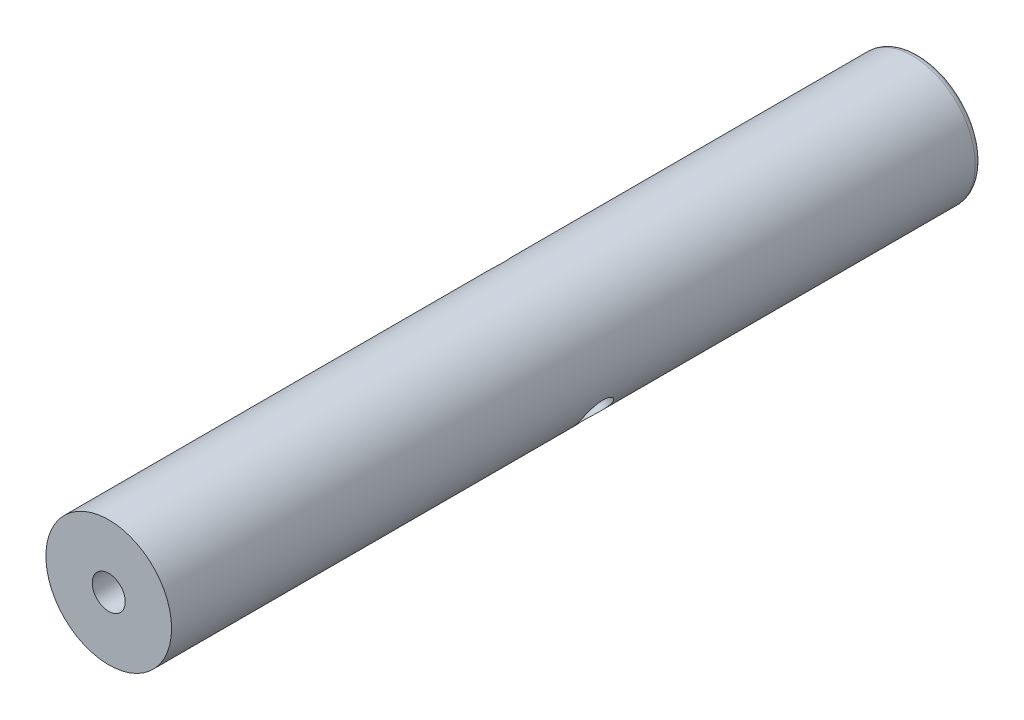
ISO-10303-21;
HEADER;
FILE_DESCRIPTION(('STEP AP214'),'2;1');
FILE_NAME('part.step','',(''),(''),'','','');
FILE_SCHEMA(('AUTOMOTIVE_DESIGN { 1 0 10303 214 1 1 1 1 }'));
ENDSEC;
DATA;
#1=APPLICATION_CONTEXT('core data for automotive mechanical design processes');
#2=APPLICATION_PROTOCOL_DEFINITION('international standard','automotive_design',2000,#1);
#3=PRODUCT_CONTEXT('',#1,'mechanical');
#4=PRODUCT('Part','Part','',(#3));
#5=PRODUCT_RELATED_PRODUCT_CATEGORY('part','',(#4));
#6=PRODUCT_DEFINITION_FORMATION('','',#4);
#7=PRODUCT_DEFINITION_CONTEXT('part definition',#1,'design');
#8=PRODUCT_DEFINITION('design','',#6,#7);
#9=PRODUCT_DEFINITION_SHAPE('','',#8);
#10=(LENGTH_UNIT() NAMED_UNIT(*) SI_UNIT(.MILLI.,.METRE.));
#11=(NAMED_UNIT(*) PLANE_ANGLE_UNIT() SI_UNIT($,.RADIAN.));
#12=(NAMED_UNIT(*) SI_UNIT($,.STERADIAN.) SOLID_ANGLE_UNIT());
#13=UNCERTAINTY_MEASURE_WITH_UNIT(LENGTH_MEASURE(1.E-05),#10,'distance_accuracy_value','');
#14=(GEOMETRIC_REPRESENTATION_CONTEXT(3) GLOBAL_UNCERTAINTY_ASSIGNED_CONTEXT((#13)) GLOBAL_UNIT_ASSIGNED_CONTEXT((#10,
#11,#12)) REPRESENTATION_CONTEXT('',''));
#15=CARTESIAN_POINT('',(0.,0.,0.));
#16=DIRECTION('',(0.,0.,1.));
#17=DIRECTION('',(1.,0.,0.));
#18=AXIS2_PLACEMENT_3D('',#15,#16,#17);
#19=CARTESIAN_POINT('',(240.70838830179,2.59608285867271,61.3999999999995));
#20=DIRECTION('',(0.,0.,-0.999999999999996));
#21=DIRECTION('',(-1.00000000000001,0.,0.));
#22=AXIS2_PLACEMENT_3D('',#19,#20,#21);
#23=CYLINDRICAL_SURFACE('',#22,4.76250000000001);
#24=CARTESIAN_POINT('',(243.739496509193,-1.0773064870155,28.4318732039602));
#25=CARTESIAN_POINT('',(243.739498519894,-1.07730577524482,28.5007758942927));
#26=CARTESIAN_POINT('',(243.744075456086,-1.07354273798289,28.5696972286483));
#27=CARTESIAN_POINT('',(243.762119238602,-1.05853978642648,28.705552344353));
#28=CARTESIAN_POINT('',(243.775590727344,-1.04729596759403,28.7724850686939));
#29=CARTESIAN_POINT('',(243.810635827868,-1.01750133731841,28.9023780880109));
#30=CARTESIAN_POINT('',(243.832198287884,-0.998960581516191,28.9653437119594));
#31=CARTESIAN_POINT('',(243.882308242327,-0.954797208379126,29.0857622526395));
#32=CARTESIAN_POINT('',(243.910856216812,-0.929174104315618,29.1432147901229));
#33=CARTESIAN_POINT('',(243.974288598,-0.870501019559759,29.2523687474057));
#34=CARTESIAN_POINT('',(244.009298005647,-0.837300772366983,29.3039167848535));
#35=CARTESIAN_POINT('',(244.083660587785,-0.76422315865763,29.3984437669702));
#36=CARTESIAN_POINT('',(244.123014200296,-0.724345118617391,29.4414218463124));
#37=CARTESIAN_POINT('',(244.20507205473,-0.637833110240413,29.5182254150977));
#38=CARTESIAN_POINT('',(244.247818742343,-0.591104094712533,29.5518988829388));
#39=CARTESIAN_POINT('',(244.334381768215,-0.492264048628885,29.6081467010068));
#40=CARTESIAN_POINT('',(244.378197930724,-0.440153897883894,29.6307228621673));
#41=CARTESIAN_POINT('',(244.464251396214,-0.332997816090601,29.6636401186979));
#42=CARTESIAN_POINT('',(244.506502145405,-0.278042885752271,29.6742420150192));
#43=CARTESIAN_POINT('',(244.588981672307,-0.165665820691008,29.6837298339136));
#44=CARTESIAN_POINT('',(244.629210777198,-0.108244088000552,29.6826176584528));
#45=CARTESIAN_POINT('',(244.705516642823,0.00591430996196155,29.6688935708931));
#46=CARTESIAN_POINT('',(244.741670854886,0.0626334219955251,29.6565633630841));
#47=CARTESIAN_POINT('',(244.810133637041,0.175044808568638,29.6212077315072));
#48=CARTESIAN_POINT('',(244.842441991252,0.230737025317004,29.598181707703));
#49=CARTESIAN_POINT('',(244.903020156513,0.339889711854959,29.541869083887));
#50=CARTESIAN_POINT('',(244.931247698698,0.393323254493654,29.5084850069056));
#51=CARTESIAN_POINT('',(244.983079813202,0.495674610777752,29.4324785152734));
#52=CARTESIAN_POINT('',(245.006683507353,0.54459156569499,29.3898543489626));
#53=CARTESIAN_POINT('',(245.04989775762,0.637661072623892,29.2950783779095));
#54=CARTESIAN_POINT('',(245.069368546031,0.681628473758173,29.2426807459363));
#55=CARTESIAN_POINT('',(245.103536442906,0.761425255275887,29.1306250628226));
#56=CARTESIAN_POINT('',(245.118233278784,0.797254170926346,29.0709665973643));
#57=CARTESIAN_POINT('',(245.143111939603,0.859486378540484,28.9455923570433));
#58=CARTESIAN_POINT('',(245.153267028014,0.885833680942785,28.8798433936525));
#59=CARTESIAN_POINT('',(245.169107962008,0.927583393434957,28.7444496506819));
#60=CARTESIAN_POINT('',(245.174794876279,0.942988420586256,28.6748058069411));
#61=CARTESIAN_POINT('',(245.181714420048,0.961806854967027,28.5357630589409));
#62=CARTESIAN_POINT('',(245.183071404982,0.965554966336933,28.4664155886794));
#63=CARTESIAN_POINT('',(245.18170911801,0.961821189174053,28.3280690975248));
#64=CARTESIAN_POINT('',(245.178990264594,0.954340453572999,28.2590700415879));
#65=CARTESIAN_POINT('',(245.169512308462,0.928762491766396,28.1246961545101));
#66=CARTESIAN_POINT('',(245.162828735592,0.910863848697898,28.0592779278115));
#67=CARTESIAN_POINT('',(245.145366727211,0.865413159289326,27.932468005841));
#68=CARTESIAN_POINT('',(245.134587769428,0.837859881757942,27.8710768252977));
#69=CARTESIAN_POINT('',(245.108499123299,0.773541667631291,27.7526151162069));
#70=CARTESIAN_POINT('',(245.093097500093,0.736592390460438,27.6956650167574));
#71=CARTESIAN_POINT('',(245.057683945292,0.655206973135304,27.5890013169025));
#72=CARTESIAN_POINT('',(245.037671174981,0.610769471352034,27.5392890356631));
#73=CARTESIAN_POINT('',(244.992299825162,0.514639661395807,27.4470885172703));
#74=CARTESIAN_POINT('',(244.96680771172,0.462779575371863,27.4048404423805));
#75=CARTESIAN_POINT('',(244.910879252779,0.354615191847352,27.3305238223897));
#76=CARTESIAN_POINT('',(244.880443169991,0.298311130571686,27.2984547366666));
#77=CARTESIAN_POINT('',(244.81518200593,0.183621935296772,27.2456971944411));
#78=CARTESIAN_POINT('',(244.780391903686,0.125255787671423,27.2249244014334));
#79=CARTESIAN_POINT('',(244.706891687592,0.008002738932392,27.1951020324189));
#80=CARTESIAN_POINT('',(244.668182415231,-0.0508840479263269,27.1860499455732));
#81=CARTESIAN_POINT('',(244.589052581292,-0.165539834920595,27.1800791403439));
#82=CARTESIAN_POINT('',(244.548717144732,-0.221349475136187,27.1828075986757));
#83=CARTESIAN_POINT('',(244.466524332763,-0.330086165554025,27.1995040684147));
#84=CARTESIAN_POINT('',(244.424667011392,-0.383013317940409,27.2134716811169));
#85=CARTESIAN_POINT('',(244.341118511407,-0.484333571402954,27.2520530243603));
#86=CARTESIAN_POINT('',(244.299428014522,-0.532753838142911,27.2765971606083));
#87=CARTESIAN_POINT('',(244.217419210603,-0.624460112736745,27.3355725095559));
#88=CARTESIAN_POINT('',(244.177101092105,-0.66774541717421,27.3700050746239));
#89=CARTESIAN_POINT('',(244.098329497188,-0.749513409451317,27.4488236639708));
#90=CARTESIAN_POINT('',(244.05995167781,-0.787842108545239,27.4934450395442));
#91=CARTESIAN_POINT('',(243.987806897313,-0.857806378664281,27.5909255265778));
#92=CARTESIAN_POINT('',(243.954041140034,-0.889440203372806,27.6437867811307));
#93=CARTESIAN_POINT('',(243.891993966997,-0.946214584590143,27.7575896281603));
#94=CARTESIAN_POINT('',(243.863843413065,-0.971203925533231,27.8186782739811));
#95=CARTESIAN_POINT('',(243.815412311448,-1.01346672659896,27.9463681150341));
#96=CARTESIAN_POINT('',(243.795126465446,-1.03074538246595,28.0129655622554));
#97=CARTESIAN_POINT('',(243.766249543385,-1.05510624898559,28.1381053617466));
#98=CARTESIAN_POINT('',(243.756255861049,-1.06342318350885,28.1960901109451));
#99=CARTESIAN_POINT('',(243.742878829541,-1.07452331529563,28.313336466146));
#100=CARTESIAN_POINT('',(243.739494779437,-1.07730709933408,28.372597936082));
#101=CARTESIAN_POINT('',(243.739496509193,-1.0773064870155,28.4318732039602));
#102=B_SPLINE_CURVE_WITH_KNOTS('',3,(#24,#25,#26,#27,#28,#29,#30,#31,#32,#33,#34,#35,#36,#37,
#38,#39,#40,#41,#42,#43,#44,#45,#46,#47,#48,#49,#50,#51,#52,#53,#54,#55,#56,#57,#58,#59,#60,#61,
#62,#63,#64,#65,#66,#67,#68,#69,#70,#71,#72,#73,#74,#75,#76,#77,#78,#79,#80,#81,#82,#83,#84,#85,
#86,#87,#88,#89,#90,#91,#92,#93,#94,#95,#96,#97,#98,#99,#100,#101),.UNSPECIFIED.,.T.,.F.,(4,2,2,
2,2,2,2,2,2,2,2,2,2,2,2,2,2,2,2,2,2,2,2,2,2,2,2,2,2,2,2,2,2,2,2,2,2,2,4),(0.,0.20649018215045,
0.41308822494475,0.619402553891822,0.825731065151464,1.03657512737689,1.24744046820384,
1.46157082227239,1.67566622148605,1.8850028143705,2.09430541864816,2.29849291347872,
2.50269186462944,2.70887395720551,2.91509517032055,3.12745456303142,3.33982607908102,
3.55343184571556,3.76698650709079,3.9743499538071,4.18169211075563,4.38520571315107,
4.58874527773331,4.79663626558296,5.00456509637521,5.21829337157573,5.43201029343173,
5.64410892981014,5.85616212236818,6.06190916051432,6.26764890017793,6.47205504834509,
6.67648916497756,6.88623450605494,7.09603449065957,7.31026457561842,7.5243500856506,
7.70200728598688,7.87964564527481),.UNSPECIFIED.);
#103=CARTESIAN_POINT('',(243.739496509193,-1.0773064870155,28.4318732039602));
#104=VERTEX_POINT('',#103);
#105=EDGE_CURVE('E38',#104,#104,#102,.T.);
#106=ORIENTED_EDGE('',*,*,#105,.T.);
#107=EDGE_LOOP('',(#106));
#108=FACE_BOUND('',#107,.T.);
#109=CARTESIAN_POINT('',(236.234215934203,4.22801051488676,28.4318732039603));
#110=CARTESIAN_POINT('',(236.234215934382,4.22801264785046,28.3629705136278));
#111=CARTESIAN_POINT('',(236.236236414613,4.23358278734402,28.2940491792722));
#112=CARTESIAN_POINT('',(236.244360020071,4.25559809286702,28.1581940635675));
#113=CARTESIAN_POINT('',(236.250465277326,4.27204893797294,28.0912613392266));
#114=CARTESIAN_POINT('',(236.266861107924,4.3150263250855,27.9613683199097));
#115=CARTESIAN_POINT('',(236.277145922205,4.34153899946699,27.8984026959611));
#116=CARTESIAN_POINT('',(236.302061318451,4.40351184909499,27.7779841552811));
#117=CARTESIAN_POINT('',(236.316692199101,4.43897263927895,27.7205316177977));
#118=CARTESIAN_POINT('',(236.350841363675,4.51834538281734,27.6113776605148));
#119=CARTESIAN_POINT('',(236.370459601974,4.56242530753983,27.559829623067));
#120=CARTESIAN_POINT('',(236.414541475334,4.65690768520166,27.4653026409503));
#121=CARTESIAN_POINT('',(236.439005599198,4.70731077576813,27.4223245616082));
#122=CARTESIAN_POINT('',(236.49318486905,4.81352953958216,27.3455209928229));
#123=CARTESIAN_POINT('',(236.522975455938,4.8694169364351,27.3118475249817));
#124=CARTESIAN_POINT('',(236.587273436385,4.98399565116127,27.2555997069138));
#125=CARTESIAN_POINT('',(236.621780059174,5.04268650983035,27.2330235457532));
#126=CARTESIAN_POINT('',(236.694087626966,5.15955926297815,27.2001062892226));
#127=CARTESIAN_POINT('',(236.731798298999,5.21772347354143,27.1895043929013));
#128=CARTESIAN_POINT('',(236.81022006684,5.33296887882236,27.180016574007));
#129=CARTESIAN_POINT('',(236.850930674494,5.39005024784886,27.1811287494678));
#130=CARTESIAN_POINT('',(236.933091381253,5.50006998798284,27.1948528370275));
#131=CARTESIAN_POINT('',(236.974499093397,5.55307551689,27.2071830448364));
#132=CARTESIAN_POINT('',(237.057629497693,5.65511868546686,27.2425386764134));
#133=CARTESIAN_POINT('',(237.099352207387,5.70415610234387,27.2655647002177));
#134=CARTESIAN_POINT('',(237.18204108578,5.79767921432673,27.3218773240336));
#135=CARTESIAN_POINT('',(237.222995971842,5.84211607880274,27.355261401015));
#136=CARTESIAN_POINT('',(237.302191053574,5.92512515816486,27.4312678926476));
#137=CARTESIAN_POINT('',(237.340430732692,5.96369625870544,27.4738920589589));
#138=CARTESIAN_POINT('',(237.413750848667,6.03548459438382,27.5686680300122));
#139=CARTESIAN_POINT('',(237.4487033719,6.06850829925742,27.6210656619849));
#140=CARTESIAN_POINT('',(237.512529247281,6.12734051109151,27.7331213450986));
#141=CARTESIAN_POINT('',(237.541402252263,6.15314860603751,27.7927798105573));
#142=CARTESIAN_POINT('',(237.591768961075,6.19736387570878,27.9181540508784));
#143=CARTESIAN_POINT('',(237.613218803009,6.21572716641497,27.983903014269));
#144=CARTESIAN_POINT('',(237.647291690947,6.2445891135173,28.1192967572396));
#145=CARTESIAN_POINT('',(237.659916847539,6.25508965047902,28.1889406009805));
#146=CARTESIAN_POINT('',(237.675348616753,6.2678909807781,28.3279833489808));
#147=CARTESIAN_POINT('',(237.678429269806,6.2704206692413,28.3973308192423));
#148=CARTESIAN_POINT('',(237.675363898585,6.26789076470276,28.5356773103968));
#149=CARTESIAN_POINT('',(237.669218821571,6.2628319508572,28.6046763663338));
#150=CARTESIAN_POINT('',(237.648268337014,6.24536366589736,28.7390502534115));
#151=CARTESIAN_POINT('',(237.633624936888,6.23309164883563,28.80446848011));
#152=CARTESIAN_POINT('',(237.596603935692,6.20146677927271,28.9312784020805));
#153=CARTESIAN_POINT('',(237.57422534821,6.18211302367058,28.992669582624));
#154=CARTESIAN_POINT('',(237.522295822495,6.13606115634319,29.1111312917146));
#155=CARTESIAN_POINT('',(237.492601776468,6.10921487705923,29.1680813911638));
#156=CARTESIAN_POINT('',(237.427693860297,6.04867837208012,29.2747450910188));
#157=CARTESIAN_POINT('',(237.392478986348,6.014986901453,29.3244573722585));
#158=CARTESIAN_POINT('',(237.316993554331,5.94014407080298,29.4166578906512));
#159=CARTESIAN_POINT('',(237.276609380597,5.89881085314434,29.4589059655405));
#160=CARTESIAN_POINT('',(237.193300942657,5.81000077178608,29.5332225855308));
#161=CARTESIAN_POINT('',(237.150376813496,5.7625242345564,29.565291671254));
#162=CARTESIAN_POINT('',(237.064030975152,5.66273932964525,29.6180492134796));
#163=CARTESIAN_POINT('',(237.020615494821,5.61047027120394,29.6388220064872));
#164=CARTESIAN_POINT('',(236.934601414512,5.50206299657204,29.6686443755017));
#165=CARTESIAN_POINT('',(236.892002641503,5.44592561177877,29.6776964623475));
#166=CARTESIAN_POINT('',(236.81031517781,5.33307775674519,29.6836672675767));
#167=CARTESIAN_POINT('',(236.771159775926,5.27643397609054,29.6809388092449));
#168=CARTESIAN_POINT('',(236.696074161562,5.16267336472571,29.6642423395058));
#169=CARTESIAN_POINT('',(236.660143834724,5.10555655086736,29.6502747268037));
#170=CARTESIAN_POINT('',(236.592502035427,4.99299220216263,29.6116933835602));
#171=CARTESIAN_POINT('',(236.560764726261,4.93753624694919,29.5871492473122));
#172=CARTESIAN_POINT('',(236.501672419633,4.82963080678321,29.5281738983647));
#173=CARTESIAN_POINT('',(236.474318022388,4.77718173423794,29.4937413332967));
#174=CARTESIAN_POINT('',(236.42351460557,4.67564365484717,29.4149227439498));
#175=CARTESIAN_POINT('',(236.400185511525,4.6266773443323,29.3703013683764));
#176=CARTESIAN_POINT('',(236.358298704435,4.53532438139132,29.2728208813428));
#177=CARTESIAN_POINT('',(236.339742236029,4.49293944644223,29.2199596267899));
#178=CARTESIAN_POINT('',(236.306920858453,4.41550599618681,29.1061567797603));
#179=CARTESIAN_POINT('',(236.292754843032,4.38063129397243,29.0450681339394));
#180=CARTESIAN_POINT('',(236.269071029214,4.32087518197724,28.9173782928864));
#181=CARTESIAN_POINT('',(236.259550100381,4.29598704402434,28.8507808456652));
#182=CARTESIAN_POINT('',(236.246218884073,4.26063726160545,28.725641046174));
#183=CARTESIAN_POINT('',(236.241712552437,4.24844144012093,28.6676562969755));
#184=CARTESIAN_POINT('',(236.23571123708,4.23212757756097,28.5504099417745));
#185=CARTESIAN_POINT('',(236.234215934048,4.22800867995123,28.4911484718385));
#186=CARTESIAN_POINT('',(236.234215934203,4.22801051488676,28.4318732039603));
#187=B_SPLINE_CURVE_WITH_KNOTS('',3,(#109,#110,#111,#112,#113,#114,#115,#116,#117,#118,#119,
#120,#121,#122,#123,#124,#125,#126,#127,#128,#129,#130,#131,#132,#133,#134,#135,#136,#137,#138,
#139,#140,#141,#142,#143,#144,#145,#146,#147,#148,#149,#150,#151,#152,#153,#154,#155,#156,#157,
#158,#159,#160,#161,#162,#163,#164,#165,#166,#167,#168,#169,#170,#171,#172,#173,#174,#175,#176,
#177,#178,#179,#180,#181,#182,#183,#184,#185,#186),.UNSPECIFIED.,.T.,.F.,(4,2,2,2,2,2,2,2,2,2,2,
2,2,2,2,2,2,2,2,2,2,2,2,2,2,2,2,2,2,2,2,2,2,2,2,2,2,2,4),(0.,0.206490182150463,
0.413088224944733,0.619402553891792,0.825731065151441,1.03657512737685,1.24744046820379,
1.46157082227237,1.67566622148606,1.88500281437053,2.09430541864821,2.29849291347874,
2.50269186462941,2.70887395720576,2.91509517032116,3.12745456303206,3.33982607908167,
3.55343184571622,3.76698650709153,3.97434995380786,4.18169211075637,4.38520571315178,
4.58874527773402,4.79663626558365,5.00456509637584,5.21829337157597,5.43201029343164,
5.64410892981012,5.85616212236817,6.06190916051432,6.26764890017794,6.47205504834508,
6.67648916497752,6.88623450605484,7.09603449065948,7.31026457561841,7.52435008565063,
7.70200728598688,7.87964564527481),.UNSPECIFIED.);
#188=CARTESIAN_POINT('',(236.234215934203,4.22801051488676,28.4318732039603));
#189=VERTEX_POINT('',#188);
#190=EDGE_CURVE('E11',#189,#189,#187,.T.);
#191=ORIENTED_EDGE('',*,*,#190,.T.);
#192=EDGE_LOOP('',(#191));
#193=FACE_BOUND('',#192,.T.);
#194=CARTESIAN_POINT('',(240.70838830179,2.5960828586727,0.5));
#195=DIRECTION('',(0.,0.,0.999999999999996));
#196=DIRECTION('',(1.00000000000001,0.,0.));
#197=AXIS2_PLACEMENT_3D('',#194,#195,#196);
#198=CIRCLE('',#197,4.76250000000001);
#199=CARTESIAN_POINT('',(245.47088830179,2.5960828586727,0.500000000000001));
#200=VERTEX_POINT('',#199);
#201=EDGE_CURVE('E75',#200,#200,#198,.T.);
#202=ORIENTED_EDGE('',*,*,#201,.T.);
#203=EDGE_LOOP('',(#202));
#204=FACE_BOUND('',#203,.T.);
#205=CARTESIAN_POINT('',(240.70838830179,2.59608285867271,61.3999999999995));
#206=DIRECTION('',(0.,0.,0.999999999999996));
#207=DIRECTION('',(1.00000000000001,0.,0.));
#208=AXIS2_PLACEMENT_3D('',#205,#206,#207);
#209=CIRCLE('',#208,4.76250000000001);
#210=CARTESIAN_POINT('',(245.47088830179,2.59608285867271,61.3999999999995));
#211=VERTEX_POINT('',#210);
#212=EDGE_CURVE('E72',#211,#211,#209,.T.);
#213=ORIENTED_EDGE('',*,*,#212,.F.);
#214=EDGE_LOOP('',(#213));
#215=FACE_BOUND('',#214,.T.);
#216=ADVANCED_FACE('F34',(#108,#193,#204,#215),#23,.T.);
#217=CARTESIAN_POINT('',(240.70838830179,2.59608285867271,61.3999999999995));
#218=DIRECTION('',(0.,0.,0.999999999999996));
#219=DIRECTION('',(1.00000000000001,0.,0.));
#220=AXIS2_PLACEMENT_3D('',#217,#218,#219);
#221=PLANE('',#220);
#222=CARTESIAN_POINT('',(240.70838830179,2.59608285867271,61.3999999999995));
#223=DIRECTION('',(0.,0.,0.999999999999996));
#224=DIRECTION('',(1.00000000000001,0.,0.));
#225=AXIS2_PLACEMENT_3D('',#222,#223,#224);
#226=CIRCLE('',#225,1.25);
#227=CARTESIAN_POINT('',(241.95838830179,2.59608285867271,61.3999999999995));
#228=VERTEX_POINT('',#227);
#229=EDGE_CURVE('E62',#228,#228,#226,.T.);
#230=ORIENTED_EDGE('',*,*,#229,.F.);
#231=EDGE_LOOP('',(#230));
#232=FACE_BOUND('',#231,.T.);
#233=ORIENTED_EDGE('',*,*,#212,.T.);
#234=EDGE_LOOP('',(#233));
#235=FACE_BOUND('',#234,.T.);
#236=ADVANCED_FACE('F99',(#232,#235),#221,.T.);
#237=CARTESIAN_POINT('',(240.70838830179,2.5960828586727,0.));
#238=DIRECTION('',(0.,0.,0.999999999999996));
#239=DIRECTION('',(1.00000000000001,0.,0.));
#240=AXIS2_PLACEMENT_3D('',#237,#238,#239);
#241=PLANE('',#240);
#242=CARTESIAN_POINT('',(240.70838830179,2.5960828586727,0.));
#243=DIRECTION('',(0.,0.,0.999999999999996));
#244=DIRECTION('',(1.00000000000001,0.,0.));
#245=AXIS2_PLACEMENT_3D('',#242,#243,#244);
#246=CIRCLE('',#245,4.26250000000001);
#247=CARTESIAN_POINT('',(244.97088830179,2.59608285867269,0.));
#248=VERTEX_POINT('',#247);
#249=EDGE_CURVE('E46',#248,#248,#246,.F.);
#250=ORIENTED_EDGE('',*,*,#249,.T.);
#251=EDGE_LOOP('',(#250));
#252=FACE_BOUND('',#251,.T.);
#253=CARTESIAN_POINT('',(240.708388301788,2.59608285867239,0.));
#254=DIRECTION('',(0.,0.,-0.999999999999996));
#255=DIRECTION('',(-1.00000000000001,0.,0.));
#256=AXIS2_PLACEMENT_3D('',#253,#254,#255);
#257=CIRCLE('',#256,2.09999999999999);
#258=CARTESIAN_POINT('',(238.608388301788,2.59608285867239,0.));
#259=VERTEX_POINT('',#258);
#260=EDGE_CURVE('E61',#259,#259,#257,.T.);
#261=ORIENTED_EDGE('',*,*,#260,.F.);
#262=EDGE_LOOP('',(#261));
#263=FACE_BOUND('',#262,.T.);
#264=ADVANCED_FACE('F98',(#252,#263),#241,.F.);
#265=CARTESIAN_POINT('',(240.708388301788,2.59608285867232,14.));
#266=DIRECTION('',(0.,0.,-0.999999999999996));
#267=DIRECTION('',(-1.00000000000001,0.,0.));
#268=AXIS2_PLACEMENT_3D('',#265,#266,#267);
#269=CONICAL_SURFACE('',#268,2.09999999999999,1.02974425867665);
#270=CARTESIAN_POINT('',(240.708388301788,2.59608285867244,15.2618072999579));
#271=VERTEX_POINT('',#270);
#272=VERTEX_LOOP('',#271);
#273=FACE_BOUND('',#272,.T.);
#274=CARTESIAN_POINT('',(240.708388301788,2.59608285867232,14.));
#275=DIRECTION('',(0.,0.,-0.999999999999996));
#276=DIRECTION('',(-1.00000000000001,0.,0.));
#277=AXIS2_PLACEMENT_3D('',#274,#275,#276);
#278=CIRCLE('',#277,2.09999999999999);
#279=CARTESIAN_POINT('',(238.608388301788,2.59608285867239,14.));
#280=VERTEX_POINT('',#279);
#281=EDGE_CURVE('E65',#280,#280,#278,.T.);
#282=ORIENTED_EDGE('',*,*,#281,.T.);
#283=EDGE_LOOP('',(#282));
#284=FACE_BOUND('',#283,.T.);
#285=ADVANCED_FACE('F94',(#273,#284),#269,.F.);
#286=CARTESIAN_POINT('',(240.708388301788,2.59608285867239,0.));
#287=DIRECTION('',(0.,0.,-0.999999999999996));
#288=DIRECTION('',(-1.00000000000001,0.,0.));
#289=AXIS2_PLACEMENT_3D('',#286,#287,#288);
#290=CYLINDRICAL_SURFACE('',#289,2.09999999999999);
#291=CARTESIAN_POINT('',(238.608388301788,2.59608285867239,14.));
#292=CARTESIAN_POINT('',(238.608388301788,2.59608285867239,13.8541666666666));
#293=CARTESIAN_POINT('',(238.608388301788,2.59608285867239,13.7083333333333));
#294=CARTESIAN_POINT('',(238.608388301788,2.59608285867239,13.4166666666666));
#295=CARTESIAN_POINT('',(238.608388301788,2.59608285867239,13.2708333333333));
#296=CARTESIAN_POINT('',(238.608388301788,2.59608285867239,12.9791666666666));
#297=CARTESIAN_POINT('',(238.608388301788,2.59608285867239,12.8333333333333));
#298=CARTESIAN_POINT('',(238.608388301788,2.59608285867239,12.5416666666666));
#299=CARTESIAN_POINT('',(238.608388301788,2.59608285867239,12.3958333333333));
#300=CARTESIAN_POINT('',(238.608388301788,2.59608285867239,12.1041666666666));
#301=CARTESIAN_POINT('',(238.608388301788,2.59608285867239,11.9583333333333));
#302=CARTESIAN_POINT('',(238.608388301788,2.59608285867239,11.6666666666666));
#303=CARTESIAN_POINT('',(238.608388301788,2.59608285867239,11.5208333333333));
#304=CARTESIAN_POINT('',(238.608388301788,2.59608285867239,11.2291666666666));
#305=CARTESIAN_POINT('',(238.608388301788,2.59608285867239,11.0833333333333));
#306=CARTESIAN_POINT('',(238.608388301788,2.59608285867239,10.7916666666666));
#307=CARTESIAN_POINT('',(238.608388301788,2.59608285867239,10.6458333333333));
#308=CARTESIAN_POINT('',(238.608388301788,2.59608285867239,10.3541666666666));
#309=CARTESIAN_POINT('',(238.608388301788,2.59608285867239,10.2083333333333));
#310=CARTESIAN_POINT('',(238.608388301788,2.59608285867239,9.91666666666664));
#311=CARTESIAN_POINT('',(238.608388301788,2.59608285867239,9.7708333333333));
#312=CARTESIAN_POINT('',(238.608388301788,2.59608285867239,9.47916666666664));
#313=CARTESIAN_POINT('',(238.608388301788,2.59608285867239,9.3333333333333));
#314=CARTESIAN_POINT('',(238.608388301788,2.59608285867239,9.04166666666664));
#315=CARTESIAN_POINT('',(238.608388301788,2.59608285867239,8.89583333333331));
#316=CARTESIAN_POINT('',(238.608388301788,2.59608285867239,8.60416666666664));
#317=CARTESIAN_POINT('',(238.608388301788,2.59608285867239,8.45833333333331));
#318=CARTESIAN_POINT('',(238.608388301788,2.59608285867239,8.16666666666664));
#319=CARTESIAN_POINT('',(238.608388301788,2.59608285867239,8.02083333333331));
#320=CARTESIAN_POINT('',(238.608388301788,2.59608285867239,7.72916666666664));
#321=CARTESIAN_POINT('',(238.608388301788,2.59608285867239,7.58333333333331));
#322=CARTESIAN_POINT('',(238.608388301788,2.59608285867239,7.29166666666664));
#323=CARTESIAN_POINT('',(238.608388301788,2.59608285867239,7.14583333333331));
#324=CARTESIAN_POINT('',(238.608388301788,2.59608285867239,6.85416666666665));
#325=CARTESIAN_POINT('',(238.608388301788,2.59608285867239,6.70833333333331));
#326=CARTESIAN_POINT('',(238.608388301788,2.59608285867239,6.41666666666665));
#327=CARTESIAN_POINT('',(238.608388301788,2.59608285867239,6.27083333333332));
#328=CARTESIAN_POINT('',(238.608388301788,2.59608285867239,5.97916666666665));
#329=CARTESIAN_POINT('',(238.608388301788,2.59608285867239,5.83333333333332));
#330=CARTESIAN_POINT('',(238.608388301788,2.59608285867239,5.54166666666665));
#331=CARTESIAN_POINT('',(238.608388301788,2.59608285867239,5.39583333333332));
#332=CARTESIAN_POINT('',(238.608388301788,2.59608285867239,5.10416666666665));
#333=CARTESIAN_POINT('',(238.608388301788,2.59608285867239,4.95833333333332));
#334=CARTESIAN_POINT('',(238.608388301788,2.59608285867239,4.66666666666665));
#335=CARTESIAN_POINT('',(238.608388301788,2.59608285867239,4.52083333333332));
#336=CARTESIAN_POINT('',(238.608388301788,2.59608285867239,4.22916666666665));
#337=CARTESIAN_POINT('',(238.608388301788,2.59608285867239,4.08333333333332));
#338=CARTESIAN_POINT('',(238.608388301788,2.59608285867239,3.79166666666665));
#339=CARTESIAN_POINT('',(238.608388301788,2.59608285867239,3.64583333333332));
#340=CARTESIAN_POINT('',(238.608388301788,2.59608285867239,3.35416666666666));
#341=CARTESIAN_POINT('',(238.608388301788,2.59608285867239,3.20833333333332));
#342=CARTESIAN_POINT('',(238.608388301788,2.59608285867239,2.91666666666666));
#343=CARTESIAN_POINT('',(238.608388301788,2.59608285867239,2.77083333333333));
#344=CARTESIAN_POINT('',(238.608388301788,2.59608285867239,2.47916666666666));
#345=CARTESIAN_POINT('',(238.608388301788,2.59608285867239,2.33333333333333));
#346=CARTESIAN_POINT('',(238.608388301788,2.59608285867239,2.04166666666666));
#347=CARTESIAN_POINT('',(238.608388301788,2.59608285867239,1.89583333333333));
#348=CARTESIAN_POINT('',(238.608388301788,2.59608285867239,1.60416666666666));
#349=CARTESIAN_POINT('',(238.608388301788,2.59608285867239,1.45833333333333));
#350=CARTESIAN_POINT('',(238.608388301788,2.59608285867239,1.16666666666666));
#351=CARTESIAN_POINT('',(238.608388301788,2.59608285867239,1.02083333333333));
#352=CARTESIAN_POINT('',(238.608388301788,2.59608285867239,0.729166666666664));
#353=CARTESIAN_POINT('',(238.608388301788,2.59608285867239,0.583333333333331));
#354=CARTESIAN_POINT('',(238.608388301788,2.59608285867239,0.291666666666666));
#355=CARTESIAN_POINT('',(238.608388301788,2.59608285867239,0.145833333333333));
#356=CARTESIAN_POINT('',(238.608388301788,2.59608285867239,0.));
#357=B_SPLINE_CURVE_WITH_KNOTS('',3,(#291,#292,#293,#294,#295,#296,#297,#298,#299,#300,#301,
#302,#303,#304,#305,#306,#307,#308,#309,#310,#311,#312,#313,#314,#315,#316,#317,#318,#319,#320,
#321,#322,#323,#324,#325,#326,#327,#328,#329,#330,#331,#332,#333,#334,#335,#336,#337,#338,#339,
#340,#341,#342,#343,#344,#345,#346,#347,#348,#349,#350,#351,#352,#353,#354,#355,#356),
.UNSPECIFIED.,.F.,.F.,(4,2,2,2,2,2,2,2,2,2,2,2,2,2,2,2,2,2,2,2,2,2,2,2,2,2,2,2,2,2,2,2,4),(0.,
0.437499999999999,0.874999999999997,1.31249999999999,1.74999999999999,2.18749999999999,
2.62499999999999,3.06249999999999,3.49999999999999,3.93749999999999,4.37499999999999,
4.81249999999999,5.24999999999998,5.68749999999998,6.12499999999998,6.56249999999998,
6.99999999999998,7.43749999999998,7.87499999999998,8.31249999999998,8.74999999999997,
9.18749999999997,9.62499999999997,10.0625,10.5,10.9375,11.375,11.8125,12.25,12.6875,13.125,
13.5625,14.),.UNSPECIFIED.);
#358=EDGE_CURVE('BSEAM91',#280,#259,#357,.T.);
#359=ORIENTED_EDGE('',*,*,#281,.F.);
#360=ORIENTED_EDGE('',*,*,#260,.T.);
#361=ORIENTED_EDGE('',*,*,#358,.T.);
#362=ORIENTED_EDGE('',*,*,#358,.F.);
#363=EDGE_LOOP('',(#359,#361,#360,#362));
#364=FACE_BOUND('',#363,.T.);
#365=ADVANCED_FACE('F91',(#364),#290,.F.);
#366=CARTESIAN_POINT('',(240.70838830179,2.5960828586727,0.5));
#367=DIRECTION('',(0.,0.,0.999999999999996));
#368=DIRECTION('',(1.00000000000001,0.,0.));
#369=AXIS2_PLACEMENT_3D('',#366,#367,#368);
#370=TOROIDAL_SURFACE('',#369,4.26250000000001,0.5);
#371=ORIENTED_EDGE('',*,*,#249,.F.);
#372=EDGE_LOOP('',(#371));
#373=FACE_BOUND('',#372,.T.);
#374=ORIENTED_EDGE('',*,*,#201,.F.);
#375=EDGE_LOOP('',(#374));
#376=FACE_BOUND('',#375,.T.);
#377=ADVANCED_FACE('F36',(#373,#376),#370,.T.);
#378=CARTESIAN_POINT('',(240.70838830179,2.59608285867273,56.3999999999999));
#379=DIRECTION('',(0.,0.,0.999999999999996));
#380=DIRECTION('',(1.00000000000001,0.,0.));
#381=AXIS2_PLACEMENT_3D('',#378,#379,#380);
#382=CONICAL_SURFACE('',#381,1.25,1.02974425867666);
#383=CARTESIAN_POINT('',(240.70838830179,2.59608285867264,55.6489242262155));
#384=VERTEX_POINT('',#383);
#385=VERTEX_LOOP('',#384);
#386=FACE_BOUND('',#385,.T.);
#387=CARTESIAN_POINT('',(240.70838830179,2.59608285867273,56.3999999999999));
#388=DIRECTION('',(0.,0.,0.999999999999996));
#389=DIRECTION('',(1.00000000000001,0.,0.));
#390=AXIS2_PLACEMENT_3D('',#387,#388,#389);
#391=CIRCLE('',#390,1.25);
#392=CARTESIAN_POINT('',(241.95838830179,2.59608285867271,56.3999999999999));
#393=VERTEX_POINT('',#392);
#394=EDGE_CURVE('E59',#393,#393,#391,.T.);
#395=ORIENTED_EDGE('',*,*,#394,.T.);
#396=EDGE_LOOP('',(#395));
#397=FACE_BOUND('',#396,.T.);
#398=ADVANCED_FACE('F52',(#386,#397),#382,.F.);
#399=CARTESIAN_POINT('',(240.70838830179,2.59608285867271,61.3999999999995));
#400=DIRECTION('',(0.,0.,0.999999999999996));
#401=DIRECTION('',(1.00000000000001,0.,0.));
#402=AXIS2_PLACEMENT_3D('',#399,#400,#401);
#403=CYLINDRICAL_SURFACE('',#402,1.25);
#404=CARTESIAN_POINT('',(241.95838830179,2.59608285867271,56.3999999999999));
#405=CARTESIAN_POINT('',(241.95838830179,2.59608285867271,56.4520833333333));
#406=CARTESIAN_POINT('',(241.95838830179,2.59608285867271,56.5041666666666));
#407=CARTESIAN_POINT('',(241.95838830179,2.59608285867271,56.6083333333333));
#408=CARTESIAN_POINT('',(241.95838830179,2.59608285867271,56.6604166666666));
#409=CARTESIAN_POINT('',(241.95838830179,2.59608285867271,56.7645833333332));
#410=CARTESIAN_POINT('',(241.95838830179,2.59608285867271,56.8166666666666));
#411=CARTESIAN_POINT('',(241.95838830179,2.59608285867271,56.9208333333332));
#412=CARTESIAN_POINT('',(241.95838830179,2.59608285867271,56.9729166666666));
#413=CARTESIAN_POINT('',(241.95838830179,2.59608285867271,57.0770833333332));
#414=CARTESIAN_POINT('',(241.95838830179,2.59608285867271,57.1291666666665));
#415=CARTESIAN_POINT('',(241.95838830179,2.59608285867271,57.2333333333332));
#416=CARTESIAN_POINT('',(241.95838830179,2.59608285867271,57.2854166666665));
#417=CARTESIAN_POINT('',(241.95838830179,2.59608285867271,57.3895833333332));
#418=CARTESIAN_POINT('',(241.95838830179,2.59608285867271,57.4416666666665));
#419=CARTESIAN_POINT('',(241.95838830179,2.59608285867271,57.5458333333332));
#420=CARTESIAN_POINT('',(241.95838830179,2.59608285867271,57.5979166666665));
#421=CARTESIAN_POINT('',(241.95838830179,2.59608285867271,57.7020833333331));
#422=CARTESIAN_POINT('',(241.95838830179,2.59608285867271,57.7541666666665));
#423=CARTESIAN_POINT('',(241.95838830179,2.59608285867271,57.8583333333331));
#424=CARTESIAN_POINT('',(241.95838830179,2.59608285867271,57.9104166666665));
#425=CARTESIAN_POINT('',(241.95838830179,2.59608285867271,58.0145833333331));
#426=CARTESIAN_POINT('',(241.95838830179,2.59608285867271,58.0666666666664));
#427=CARTESIAN_POINT('',(241.95838830179,2.59608285867271,58.1708333333331));
#428=CARTESIAN_POINT('',(241.95838830179,2.59608285867271,58.2229166666664));
#429=CARTESIAN_POINT('',(241.95838830179,2.59608285867271,58.3270833333331));
#430=CARTESIAN_POINT('',(241.95838830179,2.59608285867271,58.3791666666664));
#431=CARTESIAN_POINT('',(241.95838830179,2.59608285867271,58.4833333333331));
#432=CARTESIAN_POINT('',(241.95838830179,2.59608285867271,58.5354166666664));
#433=CARTESIAN_POINT('',(241.95838830179,2.59608285867271,58.6395833333331));
#434=CARTESIAN_POINT('',(241.95838830179,2.59608285867271,58.6916666666664));
#435=CARTESIAN_POINT('',(241.95838830179,2.59608285867271,58.795833333333));
#436=CARTESIAN_POINT('',(241.95838830179,2.59608285867271,58.8479166666664));
#437=CARTESIAN_POINT('',(241.95838830179,2.59608285867271,58.952083333333));
#438=CARTESIAN_POINT('',(241.95838830179,2.59608285867271,59.0041666666664));
#439=CARTESIAN_POINT('',(241.95838830179,2.59608285867271,59.108333333333));
#440=CARTESIAN_POINT('',(241.95838830179,2.59608285867271,59.1604166666663));
#441=CARTESIAN_POINT('',(241.95838830179,2.59608285867271,59.264583333333));
#442=CARTESIAN_POINT('',(241.95838830179,2.59608285867271,59.3166666666663));
#443=CARTESIAN_POINT('',(241.95838830179,2.59608285867271,59.420833333333));
#444=CARTESIAN_POINT('',(241.95838830179,2.59608285867271,59.4729166666663));
#445=CARTESIAN_POINT('',(241.95838830179,2.59608285867271,59.577083333333));
#446=CARTESIAN_POINT('',(241.95838830179,2.59608285867271,59.6291666666663));
#447=CARTESIAN_POINT('',(241.95838830179,2.59608285867271,59.733333333333));
#448=CARTESIAN_POINT('',(241.95838830179,2.59608285867271,59.7854166666663));
#449=CARTESIAN_POINT('',(241.95838830179,2.59608285867271,59.8895833333329));
#450=CARTESIAN_POINT('',(241.95838830179,2.59608285867271,59.9416666666663));
#451=CARTESIAN_POINT('',(241.95838830179,2.59608285867271,60.0458333333329));
#452=CARTESIAN_POINT('',(241.95838830179,2.59608285867271,60.0979166666663));
#453=CARTESIAN_POINT('',(241.95838830179,2.59608285867271,60.2020833333329));
#454=CARTESIAN_POINT('',(241.95838830179,2.59608285867271,60.2541666666662));
#455=CARTESIAN_POINT('',(241.95838830179,2.59608285867271,60.3583333333329));
#456=CARTESIAN_POINT('',(241.95838830179,2.59608285867271,60.4104166666662));
#457=CARTESIAN_POINT('',(241.95838830179,2.59608285867271,60.5145833333329));
#458=CARTESIAN_POINT('',(241.95838830179,2.59608285867271,60.5666666666662));
#459=CARTESIAN_POINT('',(241.95838830179,2.59608285867271,60.6708333333329));
#460=CARTESIAN_POINT('',(241.95838830179,2.59608285867271,60.7229166666662));
#461=CARTESIAN_POINT('',(241.95838830179,2.59608285867271,60.8270833333328));
#462=CARTESIAN_POINT('',(241.95838830179,2.59608285867271,60.8791666666662));
#463=CARTESIAN_POINT('',(241.95838830179,2.59608285867271,60.9833333333328));
#464=CARTESIAN_POINT('',(241.95838830179,2.59608285867271,61.0354166666662));
#465=CARTESIAN_POINT('',(241.95838830179,2.59608285867271,61.1395833333328));
#466=CARTESIAN_POINT('',(241.95838830179,2.59608285867271,61.1916666666661));
#467=CARTESIAN_POINT('',(241.95838830179,2.59608285867271,61.2958333333328));
#468=CARTESIAN_POINT('',(241.95838830179,2.59608285867271,61.3479166666661));
#469=CARTESIAN_POINT('',(241.95838830179,2.59608285867271,61.3999999999995));
#470=B_SPLINE_CURVE_WITH_KNOTS('',3,(#404,#405,#406,#407,#408,#409,#410,#411,#412,#413,#414,
#415,#416,#417,#418,#419,#420,#421,#422,#423,#424,#425,#426,#427,#428,#429,#430,#431,#432,#433,
#434,#435,#436,#437,#438,#439,#440,#441,#442,#443,#444,#445,#446,#447,#448,#449,#450,#451,#452,
#453,#454,#455,#456,#457,#458,#459,#460,#461,#462,#463,#464,#465,#466,#467,#468,#469),
.UNSPECIFIED.,.F.,.F.,(4,2,2,2,2,2,2,2,2,2,2,2,2,2,2,2,2,2,2,2,2,2,2,2,2,2,2,2,2,2,2,2,4),(0.,
0.156249999999983,0.312499999999966,0.468749999999948,0.624999999999931,0.781249999999921,
0.937499999999904,1.09374999999989,1.24999999999987,1.40624999999986,1.56249999999984,
1.71874999999982,1.87499999999981,2.0312499999998,2.18749999999978,2.34374999999976,
2.49999999999975,2.65624999999974,2.81249999999972,2.9687499999997,3.12499999999968,
3.28124999999967,3.43749999999966,3.59374999999964,3.74999999999963,3.90624999999961,
4.06249999999959,4.21874999999958,4.37499999999957,4.53124999999955,4.68749999999953,
4.84374999999952,4.9999999999995),.UNSPECIFIED.);
#471=EDGE_CURVE('BSEAM55',#393,#228,#470,.T.);
#472=ORIENTED_EDGE('',*,*,#394,.F.);
#473=ORIENTED_EDGE('',*,*,#229,.T.);
#474=ORIENTED_EDGE('',*,*,#471,.T.);
#475=ORIENTED_EDGE('',*,*,#471,.F.);
#476=EDGE_LOOP('',(#472,#474,#473,#475));
#477=FACE_BOUND('',#476,.T.);
#478=ADVANCED_FACE('F55',(#477),#403,.F.);
#479=CARTESIAN_POINT('',(236.819403783342,5.34512008382455,28.4318732039603));
#480=DIRECTION('',(-0.816584675789648,0.577225664073873,0.));
#481=DIRECTION('',(-0.577225664073877,-0.81658467578964,0.));
#482=AXIS2_PLACEMENT_3D('',#479,#480,#481);
#483=CYLINDRICAL_SURFACE('',#482,1.24999999999999);
#484=ORIENTED_EDGE('',*,*,#190,.F.);
#485=EDGE_LOOP('',(#484));
#486=FACE_BOUND('',#485,.T.);
#487=ORIENTED_EDGE('',*,*,#105,.F.);
#488=EDGE_LOOP('',(#487));
#489=FACE_BOUND('',#488,.T.);
#490=ADVANCED_FACE('F83',(#486,#489),#483,.F.);
#491=CLOSED_SHELL('',(#216,#236,#264,#285,#365,#377,#398,#478,#490));
#492=MANIFOLD_SOLID_BREP('B2',#491);
#493=ADVANCED_BREP_SHAPE_REPRESENTATION('',(#18,#492),#14);
#494=SHAPE_DEFINITION_REPRESENTATION(#9,#493);
ENDSEC;
END-ISO-10303-21;
